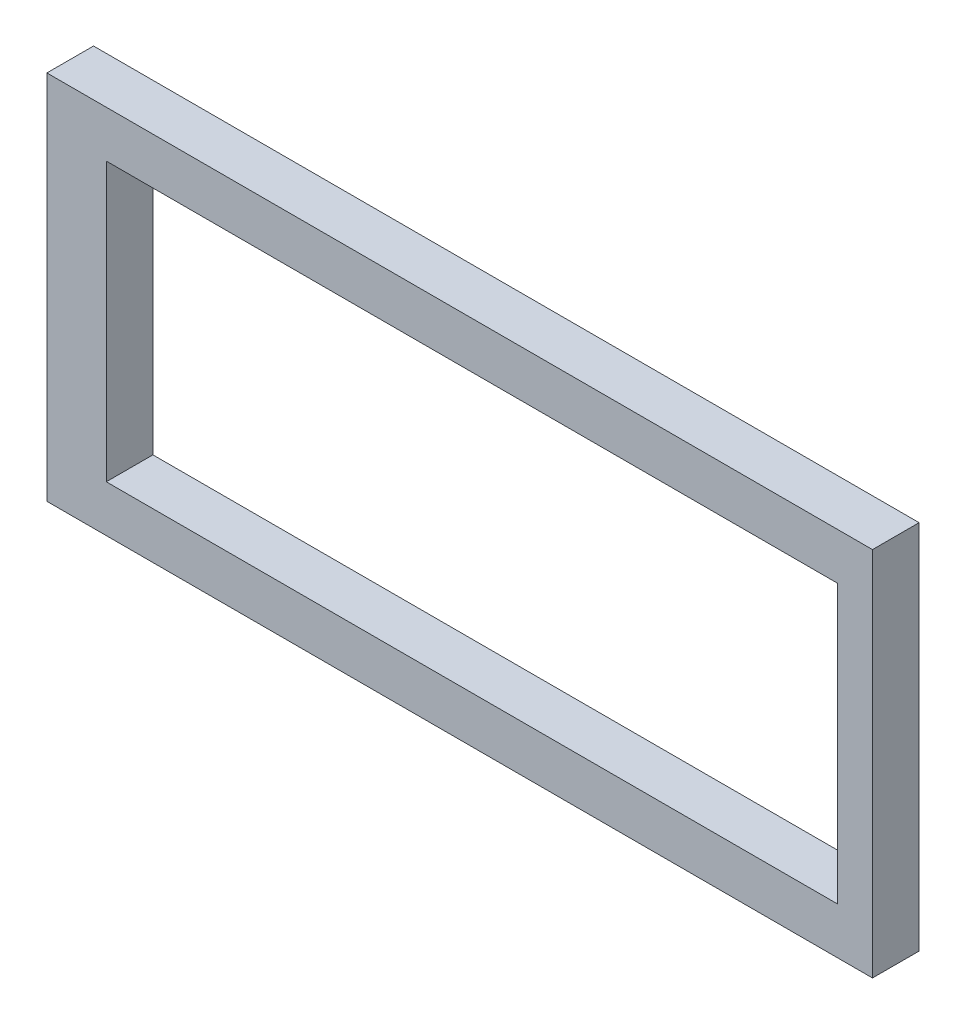
ISO-10303-21;
HEADER;
FILE_DESCRIPTION(('STEP AP214'),'2;1');
FILE_NAME('part.step','',(''),(''),'','','');
FILE_SCHEMA(('AUTOMOTIVE_DESIGN { 1 0 10303 214 1 1 1 1 }'));
ENDSEC;
DATA;
#1=APPLICATION_CONTEXT('core data for automotive mechanical design processes');
#2=APPLICATION_PROTOCOL_DEFINITION('international standard','automotive_design',2000,#1);
#3=PRODUCT_CONTEXT('',#1,'mechanical');
#4=PRODUCT('Part','Part','',(#3));
#5=PRODUCT_RELATED_PRODUCT_CATEGORY('part','',(#4));
#6=PRODUCT_DEFINITION_FORMATION('','',#4);
#7=PRODUCT_DEFINITION_CONTEXT('part definition',#1,'design');
#8=PRODUCT_DEFINITION('design','',#6,#7);
#9=PRODUCT_DEFINITION_SHAPE('','',#8);
#10=(LENGTH_UNIT() NAMED_UNIT(*) SI_UNIT(.MILLI.,.METRE.));
#11=(NAMED_UNIT(*) PLANE_ANGLE_UNIT() SI_UNIT($,.RADIAN.));
#12=(NAMED_UNIT(*) SI_UNIT($,.STERADIAN.) SOLID_ANGLE_UNIT());
#13=UNCERTAINTY_MEASURE_WITH_UNIT(LENGTH_MEASURE(1.E-05),#10,'distance_accuracy_value','');
#14=(GEOMETRIC_REPRESENTATION_CONTEXT(3) GLOBAL_UNCERTAINTY_ASSIGNED_CONTEXT((#13)) GLOBAL_UNIT_ASSIGNED_CONTEXT((#10,
#11,#12)) REPRESENTATION_CONTEXT('',''));
#15=CARTESIAN_POINT('',(0.,0.,0.));
#16=DIRECTION('',(0.,0.,1.));
#17=DIRECTION('',(1.,0.,0.));
#18=AXIS2_PLACEMENT_3D('',#15,#16,#17);
#19=CARTESIAN_POINT('',(0.,14.8902091531781,5.));
#20=DIRECTION('',(0.,-1.,0.));
#21=DIRECTION('',(1.,0.,0.));
#22=AXIS2_PLACEMENT_3D('',#19,#20,#21);
#23=PLANE('',#22);
#24=DIRECTION('',(-1.,0.,0.));
#25=VECTOR('',#24,1.);
#26=CARTESIAN_POINT('',(0.,14.8902091531781,0.));
#27=LINE('',#26,#25);
#28=CARTESIAN_POINT('',(135.617446588756,14.8902091531781,0.));
#29=VERTEX_POINT('',#28);
#30=CARTESIAN_POINT('',(57.2375428688146,14.8902091531781,0.));
#31=VERTEX_POINT('',#30);
#32=EDGE_CURVE('E154',#29,#31,#27,.T.);
#33=ORIENTED_EDGE('',*,*,#32,.F.);
#34=DIRECTION('',(0.,0.,-1.));
#35=VECTOR('',#34,1.);
#36=CARTESIAN_POINT('',(135.617446588756,14.8902091531781,5.));
#37=LINE('',#36,#35);
#38=CARTESIAN_POINT('',(135.617446588756,14.8902091531781,5.));
#39=VERTEX_POINT('',#38);
#40=EDGE_CURVE('E11',#39,#29,#37,.T.);
#41=ORIENTED_EDGE('',*,*,#40,.F.);
#42=DIRECTION('',(-1.,0.,0.));
#43=VECTOR('',#42,1.);
#44=CARTESIAN_POINT('',(0.,14.8902091531781,5.));
#45=LINE('',#44,#43);
#46=CARTESIAN_POINT('',(57.2375428688146,14.8902091531781,5.));
#47=VERTEX_POINT('',#46);
#48=EDGE_CURVE('E126',#39,#47,#45,.T.);
#49=ORIENTED_EDGE('',*,*,#48,.T.);
#50=DIRECTION('',(0.,0.,-1.));
#51=VECTOR('',#50,1.);
#52=CARTESIAN_POINT('',(57.2375428688146,14.8902091531781,5.));
#53=LINE('',#52,#51);
#54=EDGE_CURVE('E92',#47,#31,#53,.T.);
#55=ORIENTED_EDGE('',*,*,#54,.T.);
#56=EDGE_LOOP('',(#33,#41,#49,#55));
#57=FACE_BOUND('',#56,.T.);
#58=ADVANCED_FACE('F39',(#57),#23,.T.);
#59=CARTESIAN_POINT('',(135.617446588756,0.,5.));
#60=DIRECTION('',(1.,0.,0.));
#61=DIRECTION('',(0.,0.,-1.));
#62=AXIS2_PLACEMENT_3D('',#59,#60,#61);
#63=PLANE('',#62);
#64=DIRECTION('',(0.,-1.,0.));
#65=VECTOR('',#64,1.);
#66=CARTESIAN_POINT('',(135.617446588756,0.,0.));
#67=LINE('',#66,#65);
#68=CARTESIAN_POINT('',(135.617446588756,-14.8902091531781,0.));
#69=VERTEX_POINT('',#68);
#70=EDGE_CURVE('E131',#29,#69,#67,.T.);
#71=ORIENTED_EDGE('',*,*,#70,.T.);
#72=DIRECTION('',(0.,0.,-1.));
#73=VECTOR('',#72,1.);
#74=CARTESIAN_POINT('',(135.617446588756,-14.8902091531781,5.));
#75=LINE('',#74,#73);
#76=CARTESIAN_POINT('',(135.617446588756,-14.8902091531781,5.));
#77=VERTEX_POINT('',#76);
#78=EDGE_CURVE('E49',#77,#69,#75,.T.);
#79=ORIENTED_EDGE('',*,*,#78,.F.);
#80=DIRECTION('',(0.,-1.,0.));
#81=VECTOR('',#80,1.);
#82=CARTESIAN_POINT('',(135.617446588756,0.,5.));
#83=LINE('',#82,#81);
#84=EDGE_CURVE('E122',#39,#77,#83,.T.);
#85=ORIENTED_EDGE('',*,*,#84,.F.);
#86=ORIENTED_EDGE('',*,*,#40,.T.);
#87=EDGE_LOOP('',(#71,#79,#85,#86));
#88=FACE_BOUND('',#87,.T.);
#89=ADVANCED_FACE('F129',(#88),#63,.F.);
#90=CARTESIAN_POINT('',(0.,-14.8902091531781,5.));
#91=DIRECTION('',(0.,-1.,0.));
#92=DIRECTION('',(1.,0.,0.));
#93=AXIS2_PLACEMENT_3D('',#90,#91,#92);
#94=PLANE('',#93);
#95=DIRECTION('',(-1.,0.,0.));
#96=VECTOR('',#95,1.);
#97=CARTESIAN_POINT('',(0.,-14.8902091531781,0.));
#98=LINE('',#97,#96);
#99=CARTESIAN_POINT('',(57.2375428688146,-14.8902091531781,0.));
#100=VERTEX_POINT('',#99);
#101=EDGE_CURVE('E151',#69,#100,#98,.T.);
#102=ORIENTED_EDGE('',*,*,#101,.T.);
#103=DIRECTION('',(0.,0.,-1.));
#104=VECTOR('',#103,1.);
#105=CARTESIAN_POINT('',(57.2375428688146,-14.8902091531781,5.));
#106=LINE('',#105,#104);
#107=CARTESIAN_POINT('',(57.2375428688146,-14.8902091531781,5.));
#108=VERTEX_POINT('',#107);
#109=EDGE_CURVE('E121',#108,#100,#106,.T.);
#110=ORIENTED_EDGE('',*,*,#109,.F.);
#111=DIRECTION('',(-1.,0.,0.));
#112=VECTOR('',#111,1.);
#113=CARTESIAN_POINT('',(0.,-14.8902091531781,5.));
#114=LINE('',#113,#112);
#115=EDGE_CURVE('E115',#77,#108,#114,.T.);
#116=ORIENTED_EDGE('',*,*,#115,.F.);
#117=ORIENTED_EDGE('',*,*,#78,.T.);
#118=EDGE_LOOP('',(#102,#110,#116,#117));
#119=FACE_BOUND('',#118,.T.);
#120=ADVANCED_FACE('F118',(#119),#94,.F.);
#121=CARTESIAN_POINT('',(0.,19.8902091531781,5.));
#122=DIRECTION('',(0.,1.,0.));
#123=DIRECTION('',(0.,0.,1.));
#124=AXIS2_PLACEMENT_3D('',#121,#122,#123);
#125=PLANE('',#124);
#126=DIRECTION('',(1.,0.,0.));
#127=VECTOR('',#126,1.);
#128=CARTESIAN_POINT('',(0.,19.8902091531781,0.));
#129=LINE('',#128,#127);
#130=CARTESIAN_POINT('',(50.8688571281571,19.8902091531781,0.));
#131=VERTEX_POINT('',#130);
#132=CARTESIAN_POINT('',(139.389072529733,19.8902091531781,0.));
#133=VERTEX_POINT('',#132);
#134=EDGE_CURVE('E163',#131,#133,#129,.T.);
#135=ORIENTED_EDGE('',*,*,#134,.F.);
#136=DIRECTION('',(0.,0.,-1.));
#137=VECTOR('',#136,1.);
#138=CARTESIAN_POINT('',(50.8688571281571,19.8902091531781,5.));
#139=LINE('',#138,#137);
#140=CARTESIAN_POINT('',(50.8688571281571,19.8902091531781,5.));
#141=VERTEX_POINT('',#140);
#142=EDGE_CURVE('E43',#141,#131,#139,.T.);
#143=ORIENTED_EDGE('',*,*,#142,.F.);
#144=DIRECTION('',(1.,0.,0.));
#145=VECTOR('',#144,1.);
#146=CARTESIAN_POINT('',(0.,19.8902091531781,5.));
#147=LINE('',#146,#145);
#148=CARTESIAN_POINT('',(139.389072529733,19.8902091531781,5.));
#149=VERTEX_POINT('',#148);
#150=EDGE_CURVE('E150',#141,#149,#147,.T.);
#151=ORIENTED_EDGE('',*,*,#150,.T.);
#152=DIRECTION('',(0.,0.,-1.));
#153=VECTOR('',#152,1.);
#154=CARTESIAN_POINT('',(139.389072529733,19.8902091531781,5.));
#155=LINE('',#154,#153);
#156=EDGE_CURVE('E136',#149,#133,#155,.T.);
#157=ORIENTED_EDGE('',*,*,#156,.T.);
#158=EDGE_LOOP('',(#135,#143,#151,#157));
#159=FACE_BOUND('',#158,.T.);
#160=ADVANCED_FACE('F41',(#159),#125,.T.);
#161=CARTESIAN_POINT('',(50.8688571281571,0.,5.));
#162=DIRECTION('',(1.,0.,0.));
#163=DIRECTION('',(0.,0.,-1.));
#164=AXIS2_PLACEMENT_3D('',#161,#162,#163);
#165=PLANE('',#164);
#166=DIRECTION('',(0.,-1.,0.));
#167=VECTOR('',#166,1.);
#168=CARTESIAN_POINT('',(50.8688571281571,0.,0.));
#169=LINE('',#168,#167);
#170=CARTESIAN_POINT('',(50.8688571281571,-19.8902091531781,0.));
#171=VERTEX_POINT('',#170);
#172=EDGE_CURVE('E161',#131,#171,#169,.T.);
#173=ORIENTED_EDGE('',*,*,#172,.T.);
#174=DIRECTION('',(0.,0.,-1.));
#175=VECTOR('',#174,1.);
#176=CARTESIAN_POINT('',(50.8688571281571,-19.8902091531781,5.));
#177=LINE('',#176,#175);
#178=CARTESIAN_POINT('',(50.8688571281571,-19.8902091531781,5.));
#179=VERTEX_POINT('',#178);
#180=EDGE_CURVE('E139',#179,#171,#177,.T.);
#181=ORIENTED_EDGE('',*,*,#180,.F.);
#182=DIRECTION('',(0.,-1.,0.));
#183=VECTOR('',#182,1.);
#184=CARTESIAN_POINT('',(50.8688571281571,0.,5.));
#185=LINE('',#184,#183);
#186=EDGE_CURVE('E173',#141,#179,#185,.T.);
#187=ORIENTED_EDGE('',*,*,#186,.F.);
#188=ORIENTED_EDGE('',*,*,#142,.T.);
#189=EDGE_LOOP('',(#173,#181,#187,#188));
#190=FACE_BOUND('',#189,.T.);
#191=ADVANCED_FACE('F184',(#190),#165,.F.);
#192=CARTESIAN_POINT('',(0.,-19.8902091531781,5.));
#193=DIRECTION('',(0.,1.,0.));
#194=DIRECTION('',(0.,0.,1.));
#195=AXIS2_PLACEMENT_3D('',#192,#193,#194);
#196=PLANE('',#195);
#197=DIRECTION('',(1.,0.,0.));
#198=VECTOR('',#197,1.);
#199=CARTESIAN_POINT('',(0.,-19.8902091531781,0.));
#200=LINE('',#199,#198);
#201=CARTESIAN_POINT('',(139.389072529733,-19.8902091531781,0.));
#202=VERTEX_POINT('',#201);
#203=EDGE_CURVE('E159',#171,#202,#200,.T.);
#204=ORIENTED_EDGE('',*,*,#203,.T.);
#205=DIRECTION('',(0.,0.,-1.));
#206=VECTOR('',#205,1.);
#207=CARTESIAN_POINT('',(139.389072529733,-19.8902091531781,5.));
#208=LINE('',#207,#206);
#209=CARTESIAN_POINT('',(139.389072529733,-19.8902091531781,5.));
#210=VERTEX_POINT('',#209);
#211=EDGE_CURVE('E138',#210,#202,#208,.T.);
#212=ORIENTED_EDGE('',*,*,#211,.F.);
#213=DIRECTION('',(1.,0.,0.));
#214=VECTOR('',#213,1.);
#215=CARTESIAN_POINT('',(0.,-19.8902091531781,5.));
#216=LINE('',#215,#214);
#217=EDGE_CURVE('E171',#179,#210,#216,.T.);
#218=ORIENTED_EDGE('',*,*,#217,.F.);
#219=ORIENTED_EDGE('',*,*,#180,.T.);
#220=EDGE_LOOP('',(#204,#212,#218,#219));
#221=FACE_BOUND('',#220,.T.);
#222=ADVANCED_FACE('F185',(#221),#196,.F.);
#223=CARTESIAN_POINT('',(139.389072529733,0.,5.));
#224=DIRECTION('',(1.,0.,0.));
#225=DIRECTION('',(0.,0.,-1.));
#226=AXIS2_PLACEMENT_3D('',#223,#224,#225);
#227=PLANE('',#226);
#228=DIRECTION('',(0.,-1.,0.));
#229=VECTOR('',#228,1.);
#230=CARTESIAN_POINT('',(139.389072529733,0.,0.));
#231=LINE('',#230,#229);
#232=EDGE_CURVE('E156',#133,#202,#231,.T.);
#233=ORIENTED_EDGE('',*,*,#232,.F.);
#234=ORIENTED_EDGE('',*,*,#156,.F.);
#235=DIRECTION('',(0.,-1.,0.));
#236=VECTOR('',#235,1.);
#237=CARTESIAN_POINT('',(139.389072529733,0.,5.));
#238=LINE('',#237,#236);
#239=EDGE_CURVE('E168',#149,#210,#238,.T.);
#240=ORIENTED_EDGE('',*,*,#239,.T.);
#241=ORIENTED_EDGE('',*,*,#211,.T.);
#242=EDGE_LOOP('',(#233,#234,#240,#241));
#243=FACE_BOUND('',#242,.T.);
#244=ADVANCED_FACE('F181',(#243),#227,.T.);
#245=CARTESIAN_POINT('',(57.2375428688146,0.,5.));
#246=DIRECTION('',(-1.,0.,0.));
#247=DIRECTION('',(0.,0.,1.));
#248=AXIS2_PLACEMENT_3D('',#245,#246,#247);
#249=PLANE('',#248);
#250=DIRECTION('',(0.,1.,0.));
#251=VECTOR('',#250,1.);
#252=CARTESIAN_POINT('',(57.2375428688146,0.,0.));
#253=LINE('',#252,#251);
#254=EDGE_CURVE('E85',#100,#31,#253,.T.);
#255=ORIENTED_EDGE('',*,*,#254,.T.);
#256=ORIENTED_EDGE('',*,*,#54,.F.);
#257=DIRECTION('',(0.,1.,0.));
#258=VECTOR('',#257,1.);
#259=CARTESIAN_POINT('',(57.2375428688146,0.,5.));
#260=LINE('',#259,#258);
#261=EDGE_CURVE('E58',#108,#47,#260,.T.);
#262=ORIENTED_EDGE('',*,*,#261,.F.);
#263=ORIENTED_EDGE('',*,*,#109,.T.);
#264=EDGE_LOOP('',(#255,#256,#262,#263));
#265=FACE_BOUND('',#264,.T.);
#266=ADVANCED_FACE('F192',(#265),#249,.F.);
#267=CARTESIAN_POINT('',(0.,0.,5.));
#268=DIRECTION('',(0.,0.,1.));
#269=DIRECTION('',(1.,0.,0.));
#270=AXIS2_PLACEMENT_3D('',#267,#268,#269);
#271=PLANE('',#270);
#272=ORIENTED_EDGE('',*,*,#150,.F.);
#273=ORIENTED_EDGE('',*,*,#186,.T.);
#274=ORIENTED_EDGE('',*,*,#217,.T.);
#275=ORIENTED_EDGE('',*,*,#239,.F.);
#276=EDGE_LOOP('',(#272,#273,#274,#275));
#277=FACE_BOUND('',#276,.T.);
#278=ORIENTED_EDGE('',*,*,#48,.F.);
#279=ORIENTED_EDGE('',*,*,#84,.T.);
#280=ORIENTED_EDGE('',*,*,#115,.T.);
#281=ORIENTED_EDGE('',*,*,#261,.T.);
#282=EDGE_LOOP('',(#278,#279,#280,#281));
#283=FACE_BOUND('',#282,.T.);
#284=ADVANCED_FACE('F125',(#277,#283),#271,.T.);
#285=CARTESIAN_POINT('',(0.,0.,0.));
#286=DIRECTION('',(0.,0.,1.));
#287=DIRECTION('',(1.,0.,0.));
#288=AXIS2_PLACEMENT_3D('',#285,#286,#287);
#289=PLANE('',#288);
#290=ORIENTED_EDGE('',*,*,#134,.T.);
#291=ORIENTED_EDGE('',*,*,#232,.T.);
#292=ORIENTED_EDGE('',*,*,#203,.F.);
#293=ORIENTED_EDGE('',*,*,#172,.F.);
#294=EDGE_LOOP('',(#290,#291,#292,#293));
#295=FACE_BOUND('',#294,.T.);
#296=ORIENTED_EDGE('',*,*,#32,.T.);
#297=ORIENTED_EDGE('',*,*,#254,.F.);
#298=ORIENTED_EDGE('',*,*,#101,.F.);
#299=ORIENTED_EDGE('',*,*,#70,.F.);
#300=EDGE_LOOP('',(#296,#297,#298,#299));
#301=FACE_BOUND('',#300,.T.);
#302=ADVANCED_FACE('F183',(#295,#301),#289,.F.);
#303=CLOSED_SHELL('',(#58,#89,#120,#160,#191,#222,#244,#266,#284,#302));
#304=MANIFOLD_SOLID_BREP('B2',#303);
#305=ADVANCED_BREP_SHAPE_REPRESENTATION('',(#18,#304),#14);
#306=SHAPE_DEFINITION_REPRESENTATION(#9,#305);
ENDSEC;
END-ISO-10303-21;
